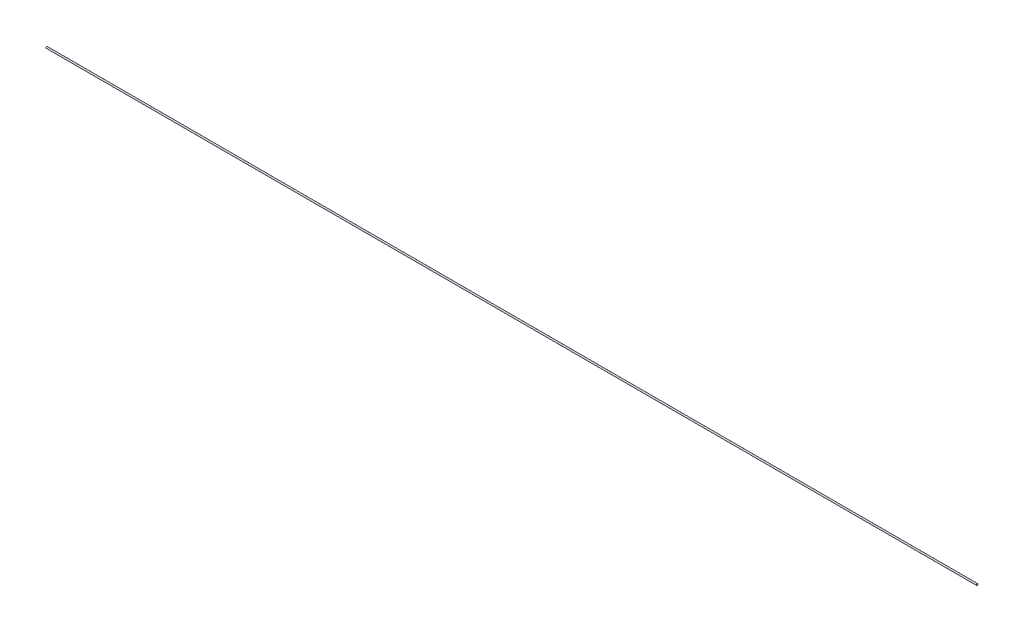
ISO-10303-21;
HEADER;
FILE_DESCRIPTION(('STEP AP214'),'2;1');
FILE_NAME('part.step','',(''),(''),'','','');
FILE_SCHEMA(('AUTOMOTIVE_DESIGN { 1 0 10303 214 1 1 1 1 }'));
ENDSEC;
DATA;
#1=APPLICATION_CONTEXT('core data for automotive mechanical design processes');
#2=APPLICATION_PROTOCOL_DEFINITION('international standard','automotive_design',2000,#1);
#3=PRODUCT_CONTEXT('',#1,'mechanical');
#4=PRODUCT('Part','Part','',(#3));
#5=PRODUCT_RELATED_PRODUCT_CATEGORY('part','',(#4));
#6=PRODUCT_DEFINITION_FORMATION('','',#4);
#7=PRODUCT_DEFINITION_CONTEXT('part definition',#1,'design');
#8=PRODUCT_DEFINITION('design','',#6,#7);
#9=PRODUCT_DEFINITION_SHAPE('','',#8);
#10=(LENGTH_UNIT() NAMED_UNIT(*) SI_UNIT(.MILLI.,.METRE.));
#11=(NAMED_UNIT(*) PLANE_ANGLE_UNIT() SI_UNIT($,.RADIAN.));
#12=(NAMED_UNIT(*) SI_UNIT($,.STERADIAN.) SOLID_ANGLE_UNIT());
#13=UNCERTAINTY_MEASURE_WITH_UNIT(LENGTH_MEASURE(1.E-05),#10,'distance_accuracy_value','');
#14=(GEOMETRIC_REPRESENTATION_CONTEXT(3) GLOBAL_UNCERTAINTY_ASSIGNED_CONTEXT((#13)) GLOBAL_UNIT_ASSIGNED_CONTEXT((#10,
#11,#12)) REPRESENTATION_CONTEXT('',''));
#15=CARTESIAN_POINT('',(0.,0.,0.));
#16=DIRECTION('',(0.,0.,1.));
#17=DIRECTION('',(1.,0.,0.));
#18=AXIS2_PLACEMENT_3D('',#15,#16,#17);
#19=CARTESIAN_POINT('',(3810.,0.,0.));
#20=DIRECTION('',(1.,0.,0.));
#21=DIRECTION('',(0.,0.,-1.));
#22=AXIS2_PLACEMENT_3D('',#19,#20,#21);
#23=PLANE('',#22);
#24=CARTESIAN_POINT('',(3810.,0.,0.));
#25=DIRECTION('',(1.,0.,0.));
#26=DIRECTION('',(0.,0.,-1.));
#27=AXIS2_PLACEMENT_3D('',#24,#25,#26);
#28=CIRCLE('',#27,6.35);
#29=CARTESIAN_POINT('',(3810.,0.,-6.35));
#30=VERTEX_POINT('',#29);
#31=EDGE_CURVE('E10',#30,#30,#28,.T.);
#32=ORIENTED_EDGE('',*,*,#31,.T.);
#33=EDGE_LOOP('',(#32));
#34=FACE_BOUND('',#33,.T.);
#35=CARTESIAN_POINT('',(3810.,0.,0.));
#36=DIRECTION('',(1.,0.,0.));
#37=DIRECTION('',(0.,0.,-1.));
#38=AXIS2_PLACEMENT_3D('',#35,#36,#37);
#39=CIRCLE('',#38,5.842);
#40=CARTESIAN_POINT('',(3810.,0.,-5.842));
#41=VERTEX_POINT('',#40);
#42=EDGE_CURVE('E41',#41,#41,#39,.T.);
#43=ORIENTED_EDGE('',*,*,#42,.F.);
#44=EDGE_LOOP('',(#43));
#45=FACE_BOUND('',#44,.T.);
#46=ADVANCED_FACE('F30',(#34,#45),#23,.T.);
#47=CARTESIAN_POINT('',(-3810.,0.,0.));
#48=DIRECTION('',(1.,0.,0.));
#49=DIRECTION('',(0.,0.,-1.));
#50=AXIS2_PLACEMENT_3D('',#47,#48,#49);
#51=PLANE('',#50);
#52=CARTESIAN_POINT('',(-3810.,0.,0.));
#53=DIRECTION('',(1.,0.,0.));
#54=DIRECTION('',(0.,0.,-1.));
#55=AXIS2_PLACEMENT_3D('',#52,#53,#54);
#56=CIRCLE('',#55,6.35);
#57=CARTESIAN_POINT('',(-3810.,0.,-6.35));
#58=VERTEX_POINT('',#57);
#59=EDGE_CURVE('E34',#58,#58,#56,.T.);
#60=ORIENTED_EDGE('',*,*,#59,.F.);
#61=EDGE_LOOP('',(#60));
#62=FACE_BOUND('',#61,.T.);
#63=CARTESIAN_POINT('',(-3810.,0.,0.));
#64=DIRECTION('',(1.,0.,0.));
#65=DIRECTION('',(0.,0.,-1.));
#66=AXIS2_PLACEMENT_3D('',#63,#64,#65);
#67=CIRCLE('',#66,5.842);
#68=CARTESIAN_POINT('',(-3810.,0.,-5.842));
#69=VERTEX_POINT('',#68);
#70=EDGE_CURVE('E43',#69,#69,#67,.T.);
#71=ORIENTED_EDGE('',*,*,#70,.T.);
#72=EDGE_LOOP('',(#71));
#73=FACE_BOUND('',#72,.T.);
#74=ADVANCED_FACE('F53',(#62,#73),#51,.F.);
#75=CARTESIAN_POINT('',(3810.,0.,0.));
#76=DIRECTION('',(-1.,0.,0.));
#77=DIRECTION('',(0.,0.,1.));
#78=AXIS2_PLACEMENT_3D('',#75,#76,#77);
#79=CYLINDRICAL_SURFACE('',#78,6.35);
#80=ORIENTED_EDGE('',*,*,#31,.F.);
#81=EDGE_LOOP('',(#80));
#82=FACE_BOUND('',#81,.T.);
#83=ORIENTED_EDGE('',*,*,#59,.T.);
#84=EDGE_LOOP('',(#83));
#85=FACE_BOUND('',#84,.T.);
#86=ADVANCED_FACE('F32',(#82,#85),#79,.T.);
#87=CARTESIAN_POINT('',(3810.,0.,0.));
#88=DIRECTION('',(-1.,0.,0.));
#89=DIRECTION('',(0.,0.,1.));
#90=AXIS2_PLACEMENT_3D('',#87,#88,#89);
#91=CYLINDRICAL_SURFACE('',#90,5.842);
#92=ORIENTED_EDGE('',*,*,#42,.T.);
#93=EDGE_LOOP('',(#92));
#94=FACE_BOUND('',#93,.T.);
#95=ORIENTED_EDGE('',*,*,#70,.F.);
#96=EDGE_LOOP('',(#95));
#97=FACE_BOUND('',#96,.T.);
#98=ADVANCED_FACE('F49',(#94,#97),#91,.F.);
#99=CLOSED_SHELL('',(#46,#74,#86,#98));
#100=MANIFOLD_SOLID_BREP('B2',#99);
#101=ADVANCED_BREP_SHAPE_REPRESENTATION('',(#18,#100),#14);
#102=SHAPE_DEFINITION_REPRESENTATION(#9,#101);
ENDSEC;
END-ISO-10303-21;
